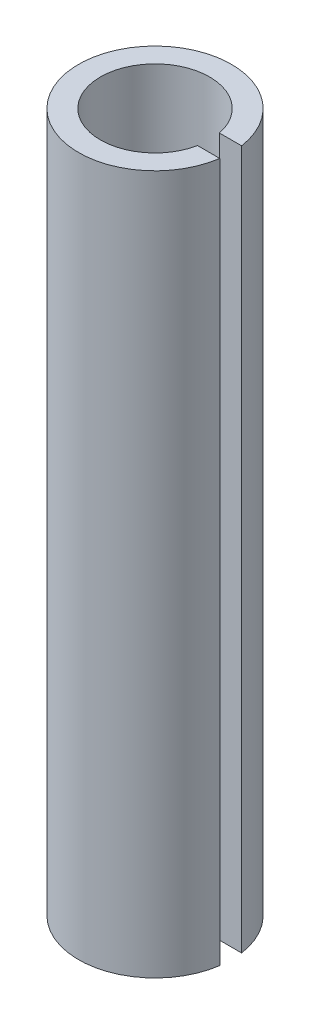
ISO-10303-21;
HEADER;
FILE_DESCRIPTION(('STEP AP214'),'2;1');
FILE_NAME('part.step','',(''),(''),'','','');
FILE_SCHEMA(('AUTOMOTIVE_DESIGN { 1 0 10303 214 1 1 1 1 }'));
ENDSEC;
DATA;
#1=APPLICATION_CONTEXT('core data for automotive mechanical design processes');
#2=APPLICATION_PROTOCOL_DEFINITION('international standard','automotive_design',2000,#1);
#3=PRODUCT_CONTEXT('',#1,'mechanical');
#4=PRODUCT('Part','Part','',(#3));
#5=PRODUCT_RELATED_PRODUCT_CATEGORY('part','',(#4));
#6=PRODUCT_DEFINITION_FORMATION('','',#4);
#7=PRODUCT_DEFINITION_CONTEXT('part definition',#1,'design');
#8=PRODUCT_DEFINITION('design','',#6,#7);
#9=PRODUCT_DEFINITION_SHAPE('','',#8);
#10=(LENGTH_UNIT() NAMED_UNIT(*) SI_UNIT(.MILLI.,.METRE.));
#11=(NAMED_UNIT(*) PLANE_ANGLE_UNIT() SI_UNIT($,.RADIAN.));
#12=(NAMED_UNIT(*) SI_UNIT($,.STERADIAN.) SOLID_ANGLE_UNIT());
#13=UNCERTAINTY_MEASURE_WITH_UNIT(LENGTH_MEASURE(1.E-05),#10,'distance_accuracy_value','');
#14=(GEOMETRIC_REPRESENTATION_CONTEXT(3) GLOBAL_UNCERTAINTY_ASSIGNED_CONTEXT((#13)) GLOBAL_UNIT_ASSIGNED_CONTEXT((#10,
#11,#12)) REPRESENTATION_CONTEXT('',''));
#15=CARTESIAN_POINT('',(0.,0.,0.));
#16=DIRECTION('',(0.,0.,1.));
#17=DIRECTION('',(1.,0.,0.));
#18=AXIS2_PLACEMENT_3D('',#15,#16,#17);
#19=CARTESIAN_POINT('',(0.,32.,0.));
#20=DIRECTION('',(0.,-1.,0.));
#21=DIRECTION('',(0.,0.,-1.));
#22=AXIS2_PLACEMENT_3D('',#19,#20,#21);
#23=CYLINDRICAL_SURFACE('',#22,2.5);
#24=CARTESIAN_POINT('',(0.,0.,0.));
#25=DIRECTION('',(0.,1.,0.));
#26=DIRECTION('',(0.,0.,1.));
#27=AXIS2_PLACEMENT_3D('',#24,#25,#26);
#28=CIRCLE('',#27,2.5);
#29=CARTESIAN_POINT('',(2.44948974278318,0.,-0.5));
#30=VERTEX_POINT('',#29);
#31=CARTESIAN_POINT('',(2.44948974278318,0.,0.5));
#32=VERTEX_POINT('',#31);
#33=EDGE_CURVE('E103',#30,#32,#28,.T.);
#34=ORIENTED_EDGE('',*,*,#33,.F.);
#35=DIRECTION('',(0.,-1.,0.));
#36=VECTOR('',#35,1.);
#37=CARTESIAN_POINT('',(2.44948974278318,32.,-0.5));
#38=LINE('',#37,#36);
#39=CARTESIAN_POINT('',(2.44948974278318,32.,-0.5));
#40=VERTEX_POINT('',#39);
#41=EDGE_CURVE('E11',#40,#30,#38,.T.);
#42=ORIENTED_EDGE('',*,*,#41,.F.);
#43=CARTESIAN_POINT('',(0.,32.,0.));
#44=DIRECTION('',(0.,1.,0.));
#45=DIRECTION('',(0.,0.,1.));
#46=AXIS2_PLACEMENT_3D('',#43,#44,#45);
#47=CIRCLE('',#46,2.5);
#48=CARTESIAN_POINT('',(2.44948974278318,32.,0.5));
#49=VERTEX_POINT('',#48);
#50=EDGE_CURVE('E88',#40,#49,#47,.T.);
#51=ORIENTED_EDGE('',*,*,#50,.T.);
#52=DIRECTION('',(0.,-1.,0.));
#53=VECTOR('',#52,1.);
#54=CARTESIAN_POINT('',(2.44948974278318,32.,0.5));
#55=LINE('',#54,#53);
#56=EDGE_CURVE('E56',#49,#32,#55,.T.);
#57=ORIENTED_EDGE('',*,*,#56,.T.);
#58=EDGE_LOOP('',(#34,#42,#51,#57));
#59=FACE_BOUND('',#58,.T.);
#60=ADVANCED_FACE('F40',(#59),#23,.F.);
#61=CARTESIAN_POINT('',(0.,32.,-0.5));
#62=DIRECTION('',(0.,0.,-1.));
#63=DIRECTION('',(-1.,0.,0.));
#64=AXIS2_PLACEMENT_3D('',#61,#62,#63);
#65=PLANE('',#64);
#66=DIRECTION('',(1.,0.,0.));
#67=VECTOR('',#66,1.);
#68=CARTESIAN_POINT('',(0.,0.,-0.5));
#69=LINE('',#68,#67);
#70=CARTESIAN_POINT('',(3.46410161513775,0.,-0.5));
#71=VERTEX_POINT('',#70);
#72=EDGE_CURVE('E94',#30,#71,#69,.T.);
#73=ORIENTED_EDGE('',*,*,#72,.T.);
#74=DIRECTION('',(0.,-1.,0.));
#75=VECTOR('',#74,1.);
#76=CARTESIAN_POINT('',(3.46410161513775,32.,-0.5));
#77=LINE('',#76,#75);
#78=CARTESIAN_POINT('',(3.46410161513775,32.,-0.5));
#79=VERTEX_POINT('',#78);
#80=EDGE_CURVE('E48',#79,#71,#77,.T.);
#81=ORIENTED_EDGE('',*,*,#80,.F.);
#82=DIRECTION('',(1.,0.,0.));
#83=VECTOR('',#82,1.);
#84=CARTESIAN_POINT('',(0.,32.,-0.5));
#85=LINE('',#84,#83);
#86=EDGE_CURVE('E82',#40,#79,#85,.T.);
#87=ORIENTED_EDGE('',*,*,#86,.F.);
#88=ORIENTED_EDGE('',*,*,#41,.T.);
#89=EDGE_LOOP('',(#73,#81,#87,#88));
#90=FACE_BOUND('',#89,.T.);
#91=ADVANCED_FACE('F92',(#90),#65,.F.);
#92=CARTESIAN_POINT('',(0.,32.,0.));
#93=DIRECTION('',(0.,-1.,0.));
#94=DIRECTION('',(0.,0.,-1.));
#95=AXIS2_PLACEMENT_3D('',#92,#93,#94);
#96=CYLINDRICAL_SURFACE('',#95,3.5);
#97=CARTESIAN_POINT('',(0.,0.,0.));
#98=DIRECTION('',(0.,1.,0.));
#99=DIRECTION('',(0.,0.,1.));
#100=AXIS2_PLACEMENT_3D('',#97,#98,#99);
#101=CIRCLE('',#100,3.5);
#102=CARTESIAN_POINT('',(3.46410161513775,0.,0.5));
#103=VERTEX_POINT('',#102);
#104=EDGE_CURVE('E106',#71,#103,#101,.T.);
#105=ORIENTED_EDGE('',*,*,#104,.T.);
#106=DIRECTION('',(0.,-1.,0.));
#107=VECTOR('',#106,1.);
#108=CARTESIAN_POINT('',(3.46410161513775,32.,0.5));
#109=LINE('',#108,#107);
#110=CARTESIAN_POINT('',(3.46410161513775,32.,0.5));
#111=VERTEX_POINT('',#110);
#112=EDGE_CURVE('E70',#111,#103,#109,.T.);
#113=ORIENTED_EDGE('',*,*,#112,.F.);
#114=CARTESIAN_POINT('',(0.,32.,0.));
#115=DIRECTION('',(0.,1.,0.));
#116=DIRECTION('',(0.,0.,1.));
#117=AXIS2_PLACEMENT_3D('',#114,#115,#116);
#118=CIRCLE('',#117,3.5);
#119=EDGE_CURVE('E87',#79,#111,#118,.T.);
#120=ORIENTED_EDGE('',*,*,#119,.F.);
#121=ORIENTED_EDGE('',*,*,#80,.T.);
#122=EDGE_LOOP('',(#105,#113,#120,#121));
#123=FACE_BOUND('',#122,.T.);
#124=ADVANCED_FACE('F97',(#123),#96,.T.);
#125=CARTESIAN_POINT('',(0.,32.,0.5));
#126=DIRECTION('',(0.,0.,-1.));
#127=DIRECTION('',(-1.,0.,0.));
#128=AXIS2_PLACEMENT_3D('',#125,#126,#127);
#129=PLANE('',#128);
#130=DIRECTION('',(1.,0.,0.));
#131=VECTOR('',#130,1.);
#132=CARTESIAN_POINT('',(0.,0.,0.5));
#133=LINE('',#132,#131);
#134=EDGE_CURVE('E108',#32,#103,#133,.T.);
#135=ORIENTED_EDGE('',*,*,#134,.F.);
#136=ORIENTED_EDGE('',*,*,#56,.F.);
#137=DIRECTION('',(1.,0.,0.));
#138=VECTOR('',#137,1.);
#139=CARTESIAN_POINT('',(0.,32.,0.5));
#140=LINE('',#139,#138);
#141=EDGE_CURVE('E98',#49,#111,#140,.T.);
#142=ORIENTED_EDGE('',*,*,#141,.T.);
#143=ORIENTED_EDGE('',*,*,#112,.T.);
#144=EDGE_LOOP('',(#135,#136,#142,#143));
#145=FACE_BOUND('',#144,.T.);
#146=ADVANCED_FACE('F113',(#145),#129,.T.);
#147=CARTESIAN_POINT('',(0.,32.,0.));
#148=DIRECTION('',(0.,1.,0.));
#149=DIRECTION('',(0.,0.,1.));
#150=AXIS2_PLACEMENT_3D('',#147,#148,#149);
#151=PLANE('',#150);
#152=ORIENTED_EDGE('',*,*,#50,.F.);
#153=ORIENTED_EDGE('',*,*,#86,.T.);
#154=ORIENTED_EDGE('',*,*,#119,.T.);
#155=ORIENTED_EDGE('',*,*,#141,.F.);
#156=EDGE_LOOP('',(#152,#153,#154,#155));
#157=FACE_BOUND('',#156,.T.);
#158=ADVANCED_FACE('F84',(#157),#151,.T.);
#159=CARTESIAN_POINT('',(0.,0.,0.));
#160=DIRECTION('',(0.,1.,0.));
#161=DIRECTION('',(0.,0.,1.));
#162=AXIS2_PLACEMENT_3D('',#159,#160,#161);
#163=PLANE('',#162);
#164=ORIENTED_EDGE('',*,*,#33,.T.);
#165=ORIENTED_EDGE('',*,*,#134,.T.);
#166=ORIENTED_EDGE('',*,*,#104,.F.);
#167=ORIENTED_EDGE('',*,*,#72,.F.);
#168=EDGE_LOOP('',(#164,#165,#166,#167));
#169=FACE_BOUND('',#168,.T.);
#170=ADVANCED_FACE('F120',(#169),#163,.F.);
#171=CLOSED_SHELL('',(#60,#91,#124,#146,#158,#170));
#172=MANIFOLD_SOLID_BREP('B2',#171);
#173=ADVANCED_BREP_SHAPE_REPRESENTATION('',(#18,#172),#14);
#174=SHAPE_DEFINITION_REPRESENTATION(#9,#173);
ENDSEC;
END-ISO-10303-21;
